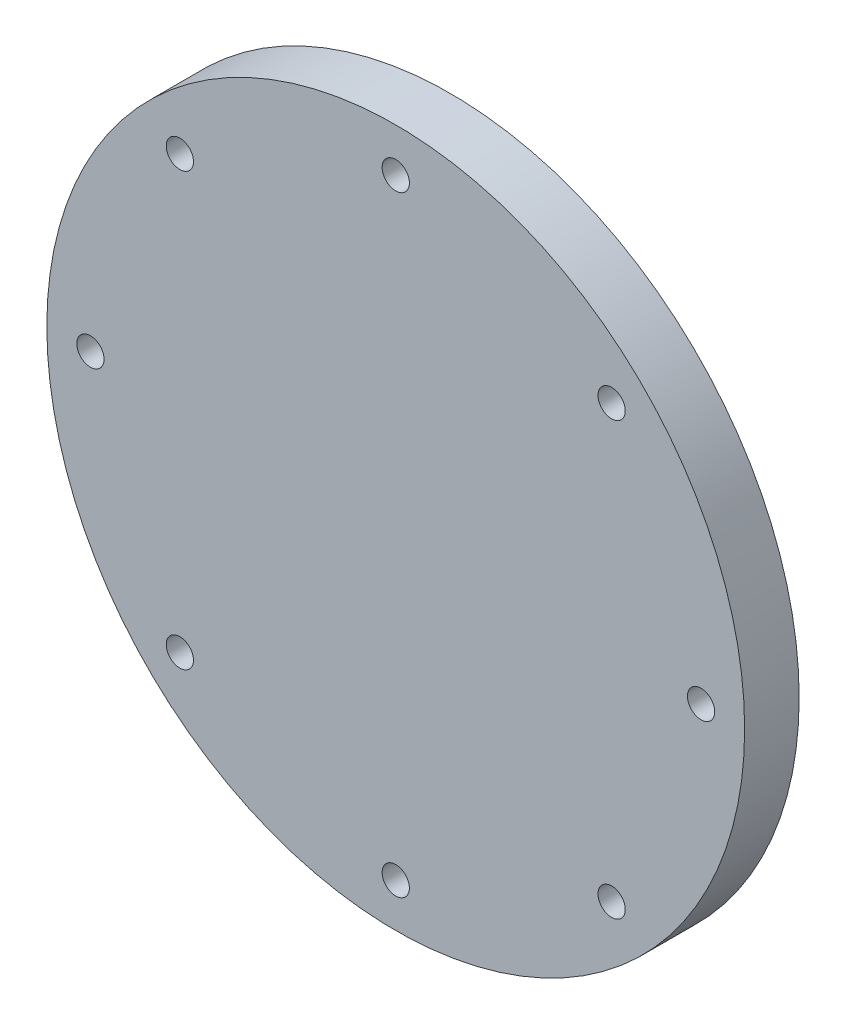
ISO-10303-21;
HEADER;
FILE_DESCRIPTION(('STEP AP214'),'2;1');
FILE_NAME('part.step','',(''),(''),'','','');
FILE_SCHEMA(('AUTOMOTIVE_DESIGN { 1 0 10303 214 1 1 1 1 }'));
ENDSEC;
DATA;
#1=APPLICATION_CONTEXT('core data for automotive mechanical design processes');
#2=APPLICATION_PROTOCOL_DEFINITION('international standard','automotive_design',2000,#1);
#3=PRODUCT_CONTEXT('',#1,'mechanical');
#4=PRODUCT('Part','Part','',(#3));
#5=PRODUCT_RELATED_PRODUCT_CATEGORY('part','',(#4));
#6=PRODUCT_DEFINITION_FORMATION('','',#4);
#7=PRODUCT_DEFINITION_CONTEXT('part definition',#1,'design');
#8=PRODUCT_DEFINITION('design','',#6,#7);
#9=PRODUCT_DEFINITION_SHAPE('','',#8);
#10=(LENGTH_UNIT() NAMED_UNIT(*) SI_UNIT(.MILLI.,.METRE.));
#11=(NAMED_UNIT(*) PLANE_ANGLE_UNIT() SI_UNIT($,.RADIAN.));
#12=(NAMED_UNIT(*) SI_UNIT($,.STERADIAN.) SOLID_ANGLE_UNIT());
#13=UNCERTAINTY_MEASURE_WITH_UNIT(LENGTH_MEASURE(1.E-05),#10,'distance_accuracy_value','');
#14=(GEOMETRIC_REPRESENTATION_CONTEXT(3) GLOBAL_UNCERTAINTY_ASSIGNED_CONTEXT((#13)) GLOBAL_UNIT_ASSIGNED_CONTEXT((#10,
#11,#12)) REPRESENTATION_CONTEXT('',''));
#15=CARTESIAN_POINT('',(0.,0.,0.));
#16=DIRECTION('',(0.,0.,1.));
#17=DIRECTION('',(1.,0.,0.));
#18=AXIS2_PLACEMENT_3D('',#15,#16,#17);
#19=CARTESIAN_POINT('',(0.,0.,5.));
#20=DIRECTION('',(0.,0.,-1.));
#21=DIRECTION('',(-1.,0.,0.));
#22=AXIS2_PLACEMENT_3D('',#19,#20,#21);
#23=CYLINDRICAL_SURFACE('',#22,32.);
#24=CARTESIAN_POINT('',(0.,0.,5.));
#25=DIRECTION('',(0.,0.,1.));
#26=DIRECTION('',(1.,0.,0.));
#27=AXIS2_PLACEMENT_3D('',#24,#25,#26);
#28=CIRCLE('',#27,32.);
#29=CARTESIAN_POINT('',(32.,0.,5.));
#30=VERTEX_POINT('',#29);
#31=EDGE_CURVE('E10',#30,#30,#28,.T.);
#32=ORIENTED_EDGE('',*,*,#31,.F.);
#33=EDGE_LOOP('',(#32));
#34=FACE_BOUND('',#33,.T.);
#35=CARTESIAN_POINT('',(0.,0.,0.));
#36=DIRECTION('',(0.,0.,1.));
#37=DIRECTION('',(1.,0.,0.));
#38=AXIS2_PLACEMENT_3D('',#35,#36,#37);
#39=CIRCLE('',#38,32.);
#40=CARTESIAN_POINT('',(32.,0.,0.));
#41=VERTEX_POINT('',#40);
#42=EDGE_CURVE('E35',#41,#41,#39,.T.);
#43=ORIENTED_EDGE('',*,*,#42,.T.);
#44=EDGE_LOOP('',(#43));
#45=FACE_BOUND('',#44,.T.);
#46=ADVANCED_FACE('F32',(#34,#45),#23,.T.);
#47=CARTESIAN_POINT('',(0.,0.,5.));
#48=DIRECTION('',(0.,0.,1.));
#49=DIRECTION('',(1.,0.,0.));
#50=AXIS2_PLACEMENT_3D('',#47,#48,#49);
#51=PLANE('',#50);
#52=CARTESIAN_POINT('',(0.,28.,5.));
#53=DIRECTION('',(0.,0.,1.));
#54=DIRECTION('',(1.,0.,0.));
#55=AXIS2_PLACEMENT_3D('',#52,#53,#54);
#56=CIRCLE('',#55,1.25);
#57=CARTESIAN_POINT('',(1.25,28.,5.));
#58=VERTEX_POINT('',#57);
#59=EDGE_CURVE('E57',#58,#58,#56,.T.);
#60=ORIENTED_EDGE('',*,*,#59,.F.);
#61=EDGE_LOOP('',(#60));
#62=FACE_BOUND('',#61,.T.);
#63=CARTESIAN_POINT('',(-19.7989898732231,19.7989898732236,5.));
#64=DIRECTION('',(0.,0.,1.));
#65=DIRECTION('',(1.,0.,0.));
#66=AXIS2_PLACEMENT_3D('',#63,#64,#65);
#67=CIRCLE('',#66,1.25);
#68=CARTESIAN_POINT('',(-18.5489898732231,19.7989898732236,5.));
#69=VERTEX_POINT('',#68);
#70=EDGE_CURVE('E70',#69,#69,#67,.T.);
#71=ORIENTED_EDGE('',*,*,#70,.F.);
#72=EDGE_LOOP('',(#71));
#73=FACE_BOUND('',#72,.T.);
#74=CARTESIAN_POINT('',(-19.7989898732235,-19.7989898732232,5.));
#75=DIRECTION('',(0.,0.,1.));
#76=DIRECTION('',(1.,0.,0.));
#77=AXIS2_PLACEMENT_3D('',#74,#75,#76);
#78=CIRCLE('',#77,1.25);
#79=CARTESIAN_POINT('',(-18.5489898732235,-19.7989898732232,5.));
#80=VERTEX_POINT('',#79);
#81=EDGE_CURVE('E76',#80,#80,#78,.T.);
#82=ORIENTED_EDGE('',*,*,#81,.F.);
#83=EDGE_LOOP('',(#82));
#84=FACE_BOUND('',#83,.T.);
#85=CARTESIAN_POINT('',(-1.90819582357449E-13,-28.,5.));
#86=DIRECTION('',(0.,0.,1.));
#87=DIRECTION('',(1.,0.,0.));
#88=AXIS2_PLACEMENT_3D('',#85,#86,#87);
#89=CIRCLE('',#88,1.25);
#90=CARTESIAN_POINT('',(1.24999999999981,-28.,5.));
#91=VERTEX_POINT('',#90);
#92=EDGE_CURVE('E82',#91,#91,#89,.T.);
#93=ORIENTED_EDGE('',*,*,#92,.F.);
#94=EDGE_LOOP('',(#93));
#95=FACE_BOUND('',#94,.T.);
#96=CARTESIAN_POINT('',(-28.,2.89102075612391E-13,5.));
#97=DIRECTION('',(0.,0.,1.));
#98=DIRECTION('',(1.,0.,0.));
#99=AXIS2_PLACEMENT_3D('',#96,#97,#98);
#100=CIRCLE('',#99,1.25);
#101=CARTESIAN_POINT('',(-26.75,2.89102075612391E-13,5.));
#102=VERTEX_POINT('',#101);
#103=EDGE_CURVE('E51',#102,#102,#100,.T.);
#104=ORIENTED_EDGE('',*,*,#103,.F.);
#105=EDGE_LOOP('',(#104));
#106=FACE_BOUND('',#105,.T.);
#107=CARTESIAN_POINT('',(19.7989898732236,19.798989873223,5.));
#108=DIRECTION('',(0.,0.,1.));
#109=DIRECTION('',(1.,0.,0.));
#110=AXIS2_PLACEMENT_3D('',#107,#108,#109);
#111=CIRCLE('',#110,1.25);
#112=CARTESIAN_POINT('',(21.0489898732236,19.798989873223,5.));
#113=VERTEX_POINT('',#112);
#114=EDGE_CURVE('E44',#113,#113,#111,.T.);
#115=ORIENTED_EDGE('',*,*,#114,.F.);
#116=EDGE_LOOP('',(#115));
#117=FACE_BOUND('',#116,.T.);
#118=CARTESIAN_POINT('',(28.,-4.83987849797529E-13,5.));
#119=DIRECTION('',(0.,0.,1.));
#120=DIRECTION('',(1.,0.,0.));
#121=AXIS2_PLACEMENT_3D('',#118,#119,#120);
#122=CIRCLE('',#121,1.25);
#123=CARTESIAN_POINT('',(29.25,-4.83987849797529E-13,5.));
#124=VERTEX_POINT('',#123);
#125=EDGE_CURVE('E65',#124,#124,#122,.T.);
#126=ORIENTED_EDGE('',*,*,#125,.F.);
#127=EDGE_LOOP('',(#126));
#128=FACE_BOUND('',#127,.T.);
#129=CARTESIAN_POINT('',(19.7989898732232,-19.7989898732234,5.));
#130=DIRECTION('',(0.,0.,1.));
#131=DIRECTION('',(1.,0.,0.));
#132=AXIS2_PLACEMENT_3D('',#129,#130,#131);
#133=CIRCLE('',#132,1.25);
#134=CARTESIAN_POINT('',(21.0489898732232,-19.7989898732234,5.));
#135=VERTEX_POINT('',#134);
#136=EDGE_CURVE('E58',#135,#135,#133,.T.);
#137=ORIENTED_EDGE('',*,*,#136,.F.);
#138=EDGE_LOOP('',(#137));
#139=FACE_BOUND('',#138,.T.);
#140=ORIENTED_EDGE('',*,*,#31,.T.);
#141=EDGE_LOOP('',(#140));
#142=FACE_BOUND('',#141,.T.);
#143=ADVANCED_FACE('F102',(#62,#73,#84,#95,#106,#117,#128,#139,#142),#51,.T.);
#144=CARTESIAN_POINT('',(0.,0.,0.));
#145=DIRECTION('',(0.,0.,1.));
#146=DIRECTION('',(1.,0.,0.));
#147=AXIS2_PLACEMENT_3D('',#144,#145,#146);
#148=PLANE('',#147);
#149=CARTESIAN_POINT('',(0.,28.,0.));
#150=DIRECTION('',(0.,0.,1.));
#151=DIRECTION('',(1.,0.,0.));
#152=AXIS2_PLACEMENT_3D('',#149,#150,#151);
#153=CIRCLE('',#152,1.25);
#154=CARTESIAN_POINT('',(1.25,28.,0.));
#155=VERTEX_POINT('',#154);
#156=EDGE_CURVE('E42',#155,#155,#153,.T.);
#157=ORIENTED_EDGE('',*,*,#156,.T.);
#158=EDGE_LOOP('',(#157));
#159=FACE_BOUND('',#158,.T.);
#160=CARTESIAN_POINT('',(-19.7989898732231,19.7989898732236,0.));
#161=DIRECTION('',(0.,0.,1.));
#162=DIRECTION('',(1.,0.,0.));
#163=AXIS2_PLACEMENT_3D('',#160,#161,#162);
#164=CIRCLE('',#163,1.25);
#165=CARTESIAN_POINT('',(-18.5489898732231,19.7989898732236,0.));
#166=VERTEX_POINT('',#165);
#167=EDGE_CURVE('E73',#166,#166,#164,.T.);
#168=ORIENTED_EDGE('',*,*,#167,.T.);
#169=EDGE_LOOP('',(#168));
#170=FACE_BOUND('',#169,.T.);
#171=CARTESIAN_POINT('',(-19.7989898732235,-19.7989898732232,0.));
#172=DIRECTION('',(0.,0.,1.));
#173=DIRECTION('',(1.,0.,0.));
#174=AXIS2_PLACEMENT_3D('',#171,#172,#173);
#175=CIRCLE('',#174,1.25);
#176=CARTESIAN_POINT('',(-18.5489898732235,-19.7989898732232,0.));
#177=VERTEX_POINT('',#176);
#178=EDGE_CURVE('E79',#177,#177,#175,.T.);
#179=ORIENTED_EDGE('',*,*,#178,.T.);
#180=EDGE_LOOP('',(#179));
#181=FACE_BOUND('',#180,.T.);
#182=CARTESIAN_POINT('',(-1.90819582357449E-13,-28.,0.));
#183=DIRECTION('',(0.,0.,1.));
#184=DIRECTION('',(1.,0.,0.));
#185=AXIS2_PLACEMENT_3D('',#182,#183,#184);
#186=CIRCLE('',#185,1.25);
#187=CARTESIAN_POINT('',(1.24999999999981,-28.,0.));
#188=VERTEX_POINT('',#187);
#189=EDGE_CURVE('E62',#188,#188,#186,.T.);
#190=ORIENTED_EDGE('',*,*,#189,.T.);
#191=EDGE_LOOP('',(#190));
#192=FACE_BOUND('',#191,.T.);
#193=CARTESIAN_POINT('',(-28.,2.89102075612391E-13,0.));
#194=DIRECTION('',(0.,0.,1.));
#195=DIRECTION('',(1.,0.,0.));
#196=AXIS2_PLACEMENT_3D('',#193,#194,#195);
#197=CIRCLE('',#196,1.25);
#198=CARTESIAN_POINT('',(-26.75,2.89102075612391E-13,0.));
#199=VERTEX_POINT('',#198);
#200=EDGE_CURVE('E54',#199,#199,#197,.T.);
#201=ORIENTED_EDGE('',*,*,#200,.T.);
#202=EDGE_LOOP('',(#201));
#203=FACE_BOUND('',#202,.T.);
#204=CARTESIAN_POINT('',(19.7989898732236,19.798989873223,0.));
#205=DIRECTION('',(0.,0.,1.));
#206=DIRECTION('',(1.,0.,0.));
#207=AXIS2_PLACEMENT_3D('',#204,#205,#206);
#208=CIRCLE('',#207,1.25);
#209=CARTESIAN_POINT('',(21.0489898732236,19.798989873223,0.));
#210=VERTEX_POINT('',#209);
#211=EDGE_CURVE('E47',#210,#210,#208,.T.);
#212=ORIENTED_EDGE('',*,*,#211,.T.);
#213=EDGE_LOOP('',(#212));
#214=FACE_BOUND('',#213,.T.);
#215=CARTESIAN_POINT('',(28.,-4.83987849797529E-13,0.));
#216=DIRECTION('',(0.,0.,1.));
#217=DIRECTION('',(1.,0.,0.));
#218=AXIS2_PLACEMENT_3D('',#215,#216,#217);
#219=CIRCLE('',#218,1.25);
#220=CARTESIAN_POINT('',(29.25,-4.83987849797529E-13,0.));
#221=VERTEX_POINT('',#220);
#222=EDGE_CURVE('E48',#221,#221,#219,.T.);
#223=ORIENTED_EDGE('',*,*,#222,.T.);
#224=EDGE_LOOP('',(#223));
#225=FACE_BOUND('',#224,.T.);
#226=CARTESIAN_POINT('',(19.7989898732232,-19.7989898732234,0.));
#227=DIRECTION('',(0.,0.,1.));
#228=DIRECTION('',(1.,0.,0.));
#229=AXIS2_PLACEMENT_3D('',#226,#227,#228);
#230=CIRCLE('',#229,1.25);
#231=CARTESIAN_POINT('',(21.0489898732232,-19.7989898732234,0.));
#232=VERTEX_POINT('',#231);
#233=EDGE_CURVE('E61',#232,#232,#230,.T.);
#234=ORIENTED_EDGE('',*,*,#233,.T.);
#235=EDGE_LOOP('',(#234));
#236=FACE_BOUND('',#235,.T.);
#237=ORIENTED_EDGE('',*,*,#42,.F.);
#238=EDGE_LOOP('',(#237));
#239=FACE_BOUND('',#238,.T.);
#240=ADVANCED_FACE('F92',(#159,#170,#181,#192,#203,#214,#225,#236,#239),#148,.F.);
#241=CARTESIAN_POINT('',(19.7989898732232,-19.7989898732234,0.));
#242=DIRECTION('',(0.,0.,1.));
#243=DIRECTION('',(1.,0.,0.));
#244=AXIS2_PLACEMENT_3D('',#241,#242,#243);
#245=CYLINDRICAL_SURFACE('',#244,1.25);
#246=ORIENTED_EDGE('',*,*,#233,.F.);
#247=EDGE_LOOP('',(#246));
#248=FACE_BOUND('',#247,.T.);
#249=ORIENTED_EDGE('',*,*,#136,.T.);
#250=EDGE_LOOP('',(#249));
#251=FACE_BOUND('',#250,.T.);
#252=ADVANCED_FACE('F120',(#248,#251),#245,.F.);
#253=CARTESIAN_POINT('',(28.,-4.83987849797529E-13,0.));
#254=DIRECTION('',(0.,0.,1.));
#255=DIRECTION('',(1.,0.,0.));
#256=AXIS2_PLACEMENT_3D('',#253,#254,#255);
#257=CYLINDRICAL_SURFACE('',#256,1.25);
#258=ORIENTED_EDGE('',*,*,#222,.F.);
#259=EDGE_LOOP('',(#258));
#260=FACE_BOUND('',#259,.T.);
#261=ORIENTED_EDGE('',*,*,#125,.T.);
#262=EDGE_LOOP('',(#261));
#263=FACE_BOUND('',#262,.T.);
#264=ADVANCED_FACE('F122',(#260,#263),#257,.F.);
#265=CARTESIAN_POINT('',(19.7989898732236,19.798989873223,0.));
#266=DIRECTION('',(0.,0.,1.));
#267=DIRECTION('',(1.,0.,0.));
#268=AXIS2_PLACEMENT_3D('',#265,#266,#267);
#269=CYLINDRICAL_SURFACE('',#268,1.25);
#270=ORIENTED_EDGE('',*,*,#211,.F.);
#271=EDGE_LOOP('',(#270));
#272=FACE_BOUND('',#271,.T.);
#273=ORIENTED_EDGE('',*,*,#114,.T.);
#274=EDGE_LOOP('',(#273));
#275=FACE_BOUND('',#274,.T.);
#276=ADVANCED_FACE('F129',(#272,#275),#269,.F.);
#277=CARTESIAN_POINT('',(-28.,2.89102075612391E-13,0.));
#278=DIRECTION('',(0.,0.,1.));
#279=DIRECTION('',(1.,0.,0.));
#280=AXIS2_PLACEMENT_3D('',#277,#278,#279);
#281=CYLINDRICAL_SURFACE('',#280,1.25);
#282=ORIENTED_EDGE('',*,*,#200,.F.);
#283=EDGE_LOOP('',(#282));
#284=FACE_BOUND('',#283,.T.);
#285=ORIENTED_EDGE('',*,*,#103,.T.);
#286=EDGE_LOOP('',(#285));
#287=FACE_BOUND('',#286,.T.);
#288=ADVANCED_FACE('F168',(#284,#287),#281,.F.);
#289=CARTESIAN_POINT('',(-1.90819582357449E-13,-28.,0.));
#290=DIRECTION('',(0.,0.,1.));
#291=DIRECTION('',(1.,0.,0.));
#292=AXIS2_PLACEMENT_3D('',#289,#290,#291);
#293=CYLINDRICAL_SURFACE('',#292,1.25);
#294=ORIENTED_EDGE('',*,*,#189,.F.);
#295=EDGE_LOOP('',(#294));
#296=FACE_BOUND('',#295,.T.);
#297=ORIENTED_EDGE('',*,*,#92,.T.);
#298=EDGE_LOOP('',(#297));
#299=FACE_BOUND('',#298,.T.);
#300=ADVANCED_FACE('F178',(#296,#299),#293,.F.);
#301=CARTESIAN_POINT('',(-19.7989898732235,-19.7989898732232,0.));
#302=DIRECTION('',(0.,0.,1.));
#303=DIRECTION('',(1.,0.,0.));
#304=AXIS2_PLACEMENT_3D('',#301,#302,#303);
#305=CYLINDRICAL_SURFACE('',#304,1.25);
#306=ORIENTED_EDGE('',*,*,#178,.F.);
#307=EDGE_LOOP('',(#306));
#308=FACE_BOUND('',#307,.T.);
#309=ORIENTED_EDGE('',*,*,#81,.T.);
#310=EDGE_LOOP('',(#309));
#311=FACE_BOUND('',#310,.T.);
#312=ADVANCED_FACE('F187',(#308,#311),#305,.F.);
#313=CARTESIAN_POINT('',(-19.7989898732231,19.7989898732236,0.));
#314=DIRECTION('',(0.,0.,1.));
#315=DIRECTION('',(1.,0.,0.));
#316=AXIS2_PLACEMENT_3D('',#313,#314,#315);
#317=CYLINDRICAL_SURFACE('',#316,1.25);
#318=ORIENTED_EDGE('',*,*,#167,.F.);
#319=EDGE_LOOP('',(#318));
#320=FACE_BOUND('',#319,.T.);
#321=ORIENTED_EDGE('',*,*,#70,.T.);
#322=EDGE_LOOP('',(#321));
#323=FACE_BOUND('',#322,.T.);
#324=ADVANCED_FACE('F98',(#320,#323),#317,.F.);
#325=CARTESIAN_POINT('',(0.,28.,0.));
#326=DIRECTION('',(0.,0.,1.));
#327=DIRECTION('',(1.,0.,0.));
#328=AXIS2_PLACEMENT_3D('',#325,#326,#327);
#329=CYLINDRICAL_SURFACE('',#328,1.25);
#330=ORIENTED_EDGE('',*,*,#156,.F.);
#331=EDGE_LOOP('',(#330));
#332=FACE_BOUND('',#331,.T.);
#333=ORIENTED_EDGE('',*,*,#59,.T.);
#334=EDGE_LOOP('',(#333));
#335=FACE_BOUND('',#334,.T.);
#336=ADVANCED_FACE('F95',(#332,#335),#329,.F.);
#337=CLOSED_SHELL('',(#46,#143,#240,#252,#264,#276,#288,#300,#312,#324,#336));
#338=MANIFOLD_SOLID_BREP('B2',#337);
#339=ADVANCED_BREP_SHAPE_REPRESENTATION('',(#18,#338),#14);
#340=SHAPE_DEFINITION_REPRESENTATION(#9,#339);
ENDSEC;
END-ISO-10303-21;
